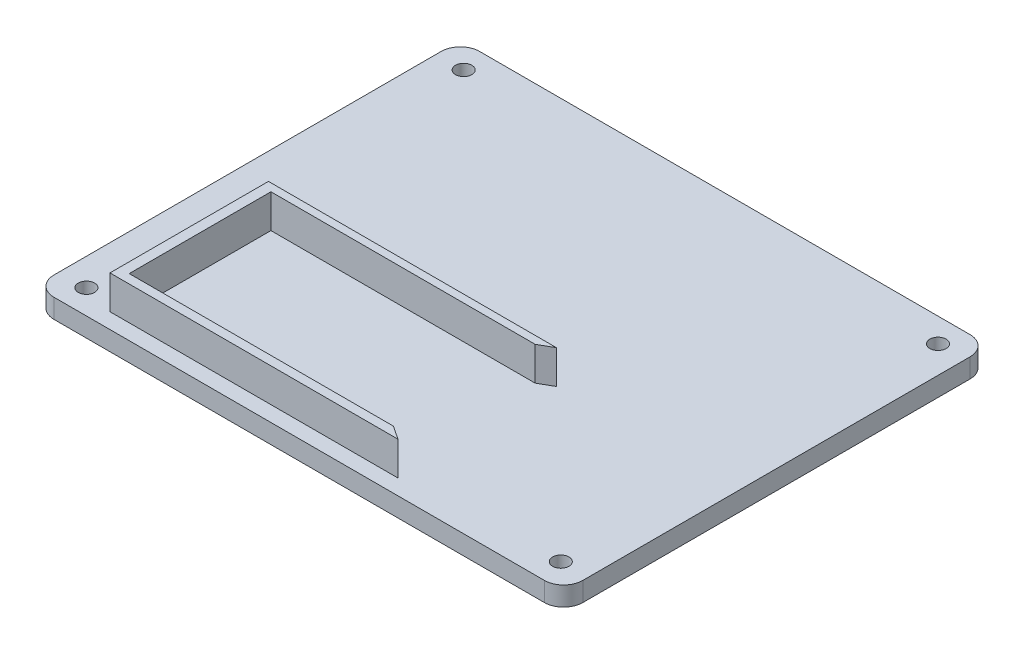
ISO-10303-21;
HEADER;
FILE_DESCRIPTION(('STEP AP214'),'2;1');
FILE_NAME('part.step','',(''),(''),'','','');
FILE_SCHEMA(('AUTOMOTIVE_DESIGN { 1 0 10303 214 1 1 1 1 }'));
ENDSEC;
DATA;
#1=APPLICATION_CONTEXT('core data for automotive mechanical design processes');
#2=APPLICATION_PROTOCOL_DEFINITION('international standard','automotive_design',2000,#1);
#3=PRODUCT_CONTEXT('',#1,'mechanical');
#4=PRODUCT('Part','Part','',(#3));
#5=PRODUCT_RELATED_PRODUCT_CATEGORY('part','',(#4));
#6=PRODUCT_DEFINITION_FORMATION('','',#4);
#7=PRODUCT_DEFINITION_CONTEXT('part definition',#1,'design');
#8=PRODUCT_DEFINITION('design','',#6,#7);
#9=PRODUCT_DEFINITION_SHAPE('','',#8);
#10=(LENGTH_UNIT() NAMED_UNIT(*) SI_UNIT(.MILLI.,.METRE.));
#11=(NAMED_UNIT(*) PLANE_ANGLE_UNIT() SI_UNIT($,.RADIAN.));
#12=(NAMED_UNIT(*) SI_UNIT($,.STERADIAN.) SOLID_ANGLE_UNIT());
#13=UNCERTAINTY_MEASURE_WITH_UNIT(LENGTH_MEASURE(1.E-05),#10,'distance_accuracy_value','');
#14=(GEOMETRIC_REPRESENTATION_CONTEXT(3) GLOBAL_UNCERTAINTY_ASSIGNED_CONTEXT((#13)) GLOBAL_UNIT_ASSIGNED_CONTEXT((#10,
#11,#12)) REPRESENTATION_CONTEXT('',''));
#15=CARTESIAN_POINT('',(0.,0.,0.));
#16=DIRECTION('',(0.,0.,1.));
#17=DIRECTION('',(1.,0.,0.));
#18=AXIS2_PLACEMENT_3D('',#15,#16,#17);
#19=CARTESIAN_POINT('',(-42.5927929016945,11.,1.87579116999913));
#20=DIRECTION('',(0.,0.,-1.));
#21=DIRECTION('',(-1.,0.,0.));
#22=AXIS2_PLACEMENT_3D('',#19,#20,#21);
#23=PLANE('',#22);
#24=DIRECTION('',(0.,-1.,0.));
#25=VECTOR('',#24,1.);
#26=CARTESIAN_POINT('',(-42.5927929016945,11.,1.87579116999913));
#27=LINE('',#26,#25);
#28=CARTESIAN_POINT('',(-42.5927929016945,11.,1.87579116999913));
#29=VERTEX_POINT('',#28);
#30=CARTESIAN_POINT('',(-42.5927929016945,4.,1.87579116999913));
#31=VERTEX_POINT('',#30);
#32=EDGE_CURVE('E165',#29,#31,#27,.T.);
#33=ORIENTED_EDGE('',*,*,#32,.T.);
#34=DIRECTION('',(1.,0.,0.));
#35=VECTOR('',#34,1.);
#36=CARTESIAN_POINT('',(-42.5927929016945,4.,1.87579116999913));
#37=LINE('',#36,#35);
#38=CARTESIAN_POINT('',(17.3465942983849,4.,1.87579116999913));
#39=VERTEX_POINT('',#38);
#40=EDGE_CURVE('E52',#31,#39,#37,.T.);
#41=ORIENTED_EDGE('',*,*,#40,.T.);
#42=DIRECTION('',(0.,-1.,0.));
#43=VECTOR('',#42,1.);
#44=CARTESIAN_POINT('',(17.3465942983849,11.,1.87579116999913));
#45=LINE('',#44,#43);
#46=CARTESIAN_POINT('',(17.3465942983849,11.,1.87579116999913));
#47=VERTEX_POINT('',#46);
#48=EDGE_CURVE('E11',#47,#39,#45,.T.);
#49=ORIENTED_EDGE('',*,*,#48,.F.);
#50=DIRECTION('',(1.,0.,0.));
#51=VECTOR('',#50,1.);
#52=CARTESIAN_POINT('',(-42.5927929016945,11.,1.87579116999913));
#53=LINE('',#52,#51);
#54=EDGE_CURVE('E250',#29,#47,#53,.T.);
#55=ORIENTED_EDGE('',*,*,#54,.F.);
#56=EDGE_LOOP('',(#33,#41,#49,#55));
#57=FACE_BOUND('',#56,.T.);
#58=ADVANCED_FACE('F39',(#57),#23,.F.);
#59=CARTESIAN_POINT('',(14.5352326793734,11.,0.));
#60=DIRECTION('',(0.555017681318776,0.,-0.831838550094626));
#61=DIRECTION('',(-0.831838550094626,0.,-0.555017681318776));
#62=AXIS2_PLACEMENT_3D('',#59,#60,#61);
#63=PLANE('',#62);
#64=DIRECTION('',(-0.831838550094626,0.,-0.555017681318776));
#65=VECTOR('',#64,1.);
#66=CARTESIAN_POINT('',(14.5352326793734,4.,0.));
#67=LINE('',#66,#65);
#68=CARTESIAN_POINT('',(14.5352326793734,4.,0.));
#69=VERTEX_POINT('',#68);
#70=EDGE_CURVE('E56',#39,#69,#67,.T.);
#71=ORIENTED_EDGE('',*,*,#70,.T.);
#72=DIRECTION('',(0.,-1.,0.));
#73=VECTOR('',#72,1.);
#74=CARTESIAN_POINT('',(14.5352326793734,11.,0.));
#75=LINE('',#74,#73);
#76=CARTESIAN_POINT('',(14.5352326793734,11.,0.));
#77=VERTEX_POINT('',#76);
#78=EDGE_CURVE('E46',#77,#69,#75,.T.);
#79=ORIENTED_EDGE('',*,*,#78,.F.);
#80=DIRECTION('',(0.831838550094626,0.,0.555017681318776));
#81=VECTOR('',#80,1.);
#82=CARTESIAN_POINT('',(14.5352326793734,11.,0.));
#83=LINE('',#82,#81);
#84=EDGE_CURVE('E249',#77,#47,#83,.T.);
#85=ORIENTED_EDGE('',*,*,#84,.T.);
#86=ORIENTED_EDGE('',*,*,#48,.T.);
#87=EDGE_LOOP('',(#71,#79,#85,#86));
#88=FACE_BOUND('',#87,.T.);
#89=ADVANCED_FACE('F301',(#88),#63,.T.);
#90=CARTESIAN_POINT('',(-40.4647673206266,11.,0.));
#91=DIRECTION('',(0.,0.,-1.));
#92=DIRECTION('',(-1.,0.,0.));
#93=AXIS2_PLACEMENT_3D('',#90,#91,#92);
#94=PLANE('',#93);
#95=DIRECTION('',(-1.,0.,0.));
#96=VECTOR('',#95,1.);
#97=CARTESIAN_POINT('',(-40.4647673206266,4.,0.));
#98=LINE('',#97,#96);
#99=CARTESIAN_POINT('',(-40.4647673206266,4.,0.));
#100=VERTEX_POINT('',#99);
#101=EDGE_CURVE('E182',#69,#100,#98,.T.);
#102=ORIENTED_EDGE('',*,*,#101,.T.);
#103=DIRECTION('',(0.,-1.,0.));
#104=VECTOR('',#103,1.);
#105=CARTESIAN_POINT('',(-40.4647673206266,11.,0.));
#106=LINE('',#105,#104);
#107=CARTESIAN_POINT('',(-40.4647673206266,11.,0.));
#108=VERTEX_POINT('',#107);
#109=EDGE_CURVE('E275',#108,#100,#106,.T.);
#110=ORIENTED_EDGE('',*,*,#109,.F.);
#111=DIRECTION('',(1.,0.,0.));
#112=VECTOR('',#111,1.);
#113=CARTESIAN_POINT('',(-40.4647673206266,11.,0.));
#114=LINE('',#113,#112);
#115=EDGE_CURVE('E252',#108,#77,#114,.T.);
#116=ORIENTED_EDGE('',*,*,#115,.T.);
#117=ORIENTED_EDGE('',*,*,#78,.T.);
#118=EDGE_LOOP('',(#102,#110,#116,#117));
#119=FACE_BOUND('',#118,.T.);
#120=ADVANCED_FACE('F277',(#119),#94,.T.);
#121=CARTESIAN_POINT('',(-40.4647673206266,11.,0.));
#122=DIRECTION('',(-1.,0.,0.));
#123=DIRECTION('',(0.,0.,1.));
#124=AXIS2_PLACEMENT_3D('',#121,#122,#123);
#125=PLANE('',#124);
#126=ORIENTED_EDGE('',*,*,#109,.T.);
#127=DIRECTION('',(0.,0.,-1.));
#128=VECTOR('',#127,1.);
#129=CARTESIAN_POINT('',(-40.4647673206266,4.,0.));
#130=LINE('',#129,#128);
#131=CARTESIAN_POINT('',(-40.4647673206266,4.,-29.5));
#132=VERTEX_POINT('',#131);
#133=EDGE_CURVE('E278',#100,#132,#130,.T.);
#134=ORIENTED_EDGE('',*,*,#133,.T.);
#135=DIRECTION('',(0.,-1.,0.));
#136=VECTOR('',#135,1.);
#137=CARTESIAN_POINT('',(-40.4647673206266,11.,-29.5));
#138=LINE('',#137,#136);
#139=CARTESIAN_POINT('',(-40.4647673206266,11.,-29.5));
#140=VERTEX_POINT('',#139);
#141=EDGE_CURVE('E267',#140,#132,#138,.T.);
#142=ORIENTED_EDGE('',*,*,#141,.F.);
#143=DIRECTION('',(0.,0.,-1.));
#144=VECTOR('',#143,1.);
#145=CARTESIAN_POINT('',(-40.4647673206266,11.,0.));
#146=LINE('',#145,#144);
#147=EDGE_CURVE('E254',#108,#140,#146,.T.);
#148=ORIENTED_EDGE('',*,*,#147,.F.);
#149=EDGE_LOOP('',(#126,#134,#142,#148));
#150=FACE_BOUND('',#149,.T.);
#151=ADVANCED_FACE('F298',(#150),#125,.F.);
#152=CARTESIAN_POINT('',(-40.4647673206266,11.,-29.5));
#153=DIRECTION('',(0.,0.,-1.));
#154=DIRECTION('',(-1.,0.,0.));
#155=AXIS2_PLACEMENT_3D('',#152,#153,#154);
#156=PLANE('',#155);
#157=ORIENTED_EDGE('',*,*,#141,.T.);
#158=DIRECTION('',(1.,0.,0.));
#159=VECTOR('',#158,1.);
#160=CARTESIAN_POINT('',(-40.4647673206266,4.,-29.5));
#161=LINE('',#160,#159);
#162=CARTESIAN_POINT('',(14.5352326793734,4.,-29.5));
#163=VERTEX_POINT('',#162);
#164=EDGE_CURVE('E284',#132,#163,#161,.T.);
#165=ORIENTED_EDGE('',*,*,#164,.T.);
#166=DIRECTION('',(0.,-1.,0.));
#167=VECTOR('',#166,1.);
#168=CARTESIAN_POINT('',(14.5352326793734,11.,-29.5));
#169=LINE('',#168,#167);
#170=CARTESIAN_POINT('',(14.5352326793734,11.,-29.5));
#171=VERTEX_POINT('',#170);
#172=EDGE_CURVE('E266',#171,#163,#169,.T.);
#173=ORIENTED_EDGE('',*,*,#172,.F.);
#174=DIRECTION('',(1.,0.,0.));
#175=VECTOR('',#174,1.);
#176=CARTESIAN_POINT('',(-40.4647673206266,11.,-29.5));
#177=LINE('',#176,#175);
#178=EDGE_CURVE('E260',#140,#171,#177,.T.);
#179=ORIENTED_EDGE('',*,*,#178,.F.);
#180=EDGE_LOOP('',(#157,#165,#173,#179));
#181=FACE_BOUND('',#180,.T.);
#182=ADVANCED_FACE('F296',(#181),#156,.F.);
#183=CARTESIAN_POINT('',(14.5352326793734,11.,-29.5));
#184=DIRECTION('',(-0.496630629517821,0.,-0.867961991002333));
#185=DIRECTION('',(-0.867961991002333,0.,0.496630629517821));
#186=AXIS2_PLACEMENT_3D('',#183,#184,#185);
#187=PLANE('',#186);
#188=ORIENTED_EDGE('',*,*,#172,.T.);
#189=DIRECTION('',(0.867961991002333,0.,-0.496630629517821));
#190=VECTOR('',#189,1.);
#191=CARTESIAN_POINT('',(14.5352326793734,4.,-29.5));
#192=LINE('',#191,#190);
#193=CARTESIAN_POINT('',(17.3465942983849,4.,-31.1086053365535));
#194=VERTEX_POINT('',#193);
#195=EDGE_CURVE('E174',#163,#194,#192,.T.);
#196=ORIENTED_EDGE('',*,*,#195,.T.);
#197=DIRECTION('',(0.,-1.,0.));
#198=VECTOR('',#197,1.);
#199=CARTESIAN_POINT('',(17.3465942983849,11.,-31.1086053365535));
#200=LINE('',#199,#198);
#201=CARTESIAN_POINT('',(17.3465942983849,11.,-31.1086053365535));
#202=VERTEX_POINT('',#201);
#203=EDGE_CURVE('E161',#202,#194,#200,.T.);
#204=ORIENTED_EDGE('',*,*,#203,.F.);
#205=DIRECTION('',(0.867961991002333,0.,-0.496630629517821));
#206=VECTOR('',#205,1.);
#207=CARTESIAN_POINT('',(14.5352326793734,11.,-29.5));
#208=LINE('',#207,#206);
#209=EDGE_CURVE('E259',#171,#202,#208,.T.);
#210=ORIENTED_EDGE('',*,*,#209,.F.);
#211=EDGE_LOOP('',(#188,#196,#204,#210));
#212=FACE_BOUND('',#211,.T.);
#213=ADVANCED_FACE('F295',(#212),#187,.F.);
#214=CARTESIAN_POINT('',(-42.5927929016945,11.,-31.1086053365535));
#215=DIRECTION('',(0.,0.,-1.));
#216=DIRECTION('',(-1.,0.,0.));
#217=AXIS2_PLACEMENT_3D('',#214,#215,#216);
#218=PLANE('',#217);
#219=DIRECTION('',(-1.,0.,0.));
#220=VECTOR('',#219,1.);
#221=CARTESIAN_POINT('',(-42.5927929016945,4.,-31.1086053365535));
#222=LINE('',#221,#220);
#223=CARTESIAN_POINT('',(-42.5927929016945,4.,-31.1086053365535));
#224=VERTEX_POINT('',#223);
#225=EDGE_CURVE('E167',#194,#224,#222,.T.);
#226=ORIENTED_EDGE('',*,*,#225,.T.);
#227=DIRECTION('',(0.,-1.,0.));
#228=VECTOR('',#227,1.);
#229=CARTESIAN_POINT('',(-42.5927929016945,11.,-31.1086053365535));
#230=LINE('',#229,#228);
#231=CARTESIAN_POINT('',(-42.5927929016945,11.,-31.1086053365535));
#232=VERTEX_POINT('',#231);
#233=EDGE_CURVE('E151',#232,#224,#230,.T.);
#234=ORIENTED_EDGE('',*,*,#233,.F.);
#235=DIRECTION('',(1.,0.,0.));
#236=VECTOR('',#235,1.);
#237=CARTESIAN_POINT('',(-42.5927929016945,11.,-31.1086053365535));
#238=LINE('',#237,#236);
#239=EDGE_CURVE('E261',#232,#202,#238,.T.);
#240=ORIENTED_EDGE('',*,*,#239,.T.);
#241=ORIENTED_EDGE('',*,*,#203,.T.);
#242=EDGE_LOOP('',(#226,#234,#240,#241));
#243=FACE_BOUND('',#242,.T.);
#244=ADVANCED_FACE('F170',(#243),#218,.T.);
#245=CARTESIAN_POINT('',(-42.5927929016945,11.,1.87579116999913));
#246=DIRECTION('',(-1.,0.,0.));
#247=DIRECTION('',(0.,0.,1.));
#248=AXIS2_PLACEMENT_3D('',#245,#246,#247);
#249=PLANE('',#248);
#250=DIRECTION('',(0.,0.,1.));
#251=VECTOR('',#250,1.);
#252=CARTESIAN_POINT('',(-42.5927929016945,4.,1.87579116999913));
#253=LINE('',#252,#251);
#254=EDGE_CURVE('E154',#224,#31,#253,.T.);
#255=ORIENTED_EDGE('',*,*,#254,.T.);
#256=ORIENTED_EDGE('',*,*,#32,.F.);
#257=DIRECTION('',(0.,0.,-1.));
#258=VECTOR('',#257,1.);
#259=CARTESIAN_POINT('',(-42.5927929016945,11.,1.87579116999913));
#260=LINE('',#259,#258);
#261=EDGE_CURVE('E160',#29,#232,#260,.T.);
#262=ORIENTED_EDGE('',*,*,#261,.T.);
#263=ORIENTED_EDGE('',*,*,#233,.T.);
#264=EDGE_LOOP('',(#255,#256,#262,#263));
#265=FACE_BOUND('',#264,.T.);
#266=ADVANCED_FACE('F153',(#265),#249,.T.);
#267=CARTESIAN_POINT('',(0.,11.,0.));
#268=DIRECTION('',(0.,1.,0.));
#269=DIRECTION('',(0.,0.,1.));
#270=AXIS2_PLACEMENT_3D('',#267,#268,#269);
#271=PLANE('',#270);
#272=ORIENTED_EDGE('',*,*,#54,.T.);
#273=ORIENTED_EDGE('',*,*,#84,.F.);
#274=ORIENTED_EDGE('',*,*,#115,.F.);
#275=ORIENTED_EDGE('',*,*,#147,.T.);
#276=ORIENTED_EDGE('',*,*,#178,.T.);
#277=ORIENTED_EDGE('',*,*,#209,.T.);
#278=ORIENTED_EDGE('',*,*,#239,.F.);
#279=ORIENTED_EDGE('',*,*,#261,.F.);
#280=EDGE_LOOP('',(#272,#273,#274,#275,#276,#277,#278,#279));
#281=FACE_BOUND('',#280,.T.);
#282=ADVANCED_FACE('F303',(#281),#271,.T.);
#283=CARTESIAN_POINT('',(51.045,4.,-79.51));
#284=DIRECTION('',(0.,1.,0.));
#285=DIRECTION('',(0.,0.,1.));
#286=AXIS2_PLACEMENT_3D('',#283,#284,#285);
#287=PLANE('',#286);
#288=CARTESIAN_POINT('',(49.365,4.,-78.51));
#289=DIRECTION('',(0.,1.,0.));
#290=DIRECTION('',(0.,0.,1.));
#291=AXIS2_PLACEMENT_3D('',#288,#289,#290);
#292=CIRCLE('',#291,1.7);
#293=CARTESIAN_POINT('',(49.365,4.,-76.81));
#294=VERTEX_POINT('',#293);
#295=EDGE_CURVE('E395',#294,#294,#292,.T.);
#296=ORIENTED_EDGE('',*,*,#295,.F.);
#297=EDGE_LOOP('',(#296));
#298=FACE_BOUND('',#297,.T.);
#299=ORIENTED_EDGE('',*,*,#164,.F.);
#300=ORIENTED_EDGE('',*,*,#133,.F.);
#301=ORIENTED_EDGE('',*,*,#101,.F.);
#302=ORIENTED_EDGE('',*,*,#70,.F.);
#303=ORIENTED_EDGE('',*,*,#40,.F.);
#304=ORIENTED_EDGE('',*,*,#254,.F.);
#305=ORIENTED_EDGE('',*,*,#225,.F.);
#306=ORIENTED_EDGE('',*,*,#195,.F.);
#307=EDGE_LOOP('',(#299,#300,#301,#302,#303,#304,#305,#306));
#308=FACE_BOUND('',#307,.T.);
#309=CARTESIAN_POINT('',(-49.365,4.,-78.51));
#310=DIRECTION('',(0.,1.,0.));
#311=DIRECTION('',(0.,0.,1.));
#312=AXIS2_PLACEMENT_3D('',#309,#310,#311);
#313=CIRCLE('',#312,1.7);
#314=CARTESIAN_POINT('',(-49.365,4.,-76.81));
#315=VERTEX_POINT('',#314);
#316=EDGE_CURVE('E184',#315,#315,#313,.T.);
#317=ORIENTED_EDGE('',*,*,#316,.F.);
#318=EDGE_LOOP('',(#317));
#319=FACE_BOUND('',#318,.T.);
#320=CARTESIAN_POINT('',(51.045,4.,-79.51));
#321=DIRECTION('',(0.,1.,0.));
#322=DIRECTION('',(0.,0.,1.));
#323=AXIS2_PLACEMENT_3D('',#320,#321,#322);
#324=CIRCLE('',#323,3.99999999999999);
#325=CARTESIAN_POINT('',(55.045,4.,-79.51));
#326=VERTEX_POINT('',#325);
#327=CARTESIAN_POINT('',(51.045,4.,-83.51));
#328=VERTEX_POINT('',#327);
#329=EDGE_CURVE('E187',#326,#328,#324,.T.);
#330=ORIENTED_EDGE('',*,*,#329,.T.);
#331=DIRECTION('',(-1.,0.,0.));
#332=VECTOR('',#331,1.);
#333=CARTESIAN_POINT('',(51.045,4.,-83.51));
#334=LINE('',#333,#332);
#335=CARTESIAN_POINT('',(-51.045,4.,-83.51));
#336=VERTEX_POINT('',#335);
#337=EDGE_CURVE('E191',#328,#336,#334,.T.);
#338=ORIENTED_EDGE('',*,*,#337,.T.);
#339=CARTESIAN_POINT('',(-51.045,4.,-79.51));
#340=DIRECTION('',(0.,1.,0.));
#341=DIRECTION('',(0.,0.,1.));
#342=AXIS2_PLACEMENT_3D('',#339,#340,#341);
#343=CIRCLE('',#342,3.99999999999999);
#344=CARTESIAN_POINT('',(-55.045,4.,-79.51));
#345=VERTEX_POINT('',#344);
#346=EDGE_CURVE('E198',#336,#345,#343,.T.);
#347=ORIENTED_EDGE('',*,*,#346,.T.);
#348=DIRECTION('',(0.,0.,1.));
#349=VECTOR('',#348,1.);
#350=CARTESIAN_POINT('',(-55.045,4.,-79.51));
#351=LINE('',#350,#349);
#352=CARTESIAN_POINT('',(-55.045,4.,1.09000000000001));
#353=VERTEX_POINT('',#352);
#354=EDGE_CURVE('E196',#345,#353,#351,.T.);
#355=ORIENTED_EDGE('',*,*,#354,.T.);
#356=CARTESIAN_POINT('',(-51.045,4.,1.09000000000001));
#357=DIRECTION('',(0.,1.,0.));
#358=DIRECTION('',(0.,0.,1.));
#359=AXIS2_PLACEMENT_3D('',#356,#357,#358);
#360=CIRCLE('',#359,4.);
#361=CARTESIAN_POINT('',(-51.045,4.,5.09000000000001));
#362=VERTEX_POINT('',#361);
#363=EDGE_CURVE('E199',#353,#362,#360,.T.);
#364=ORIENTED_EDGE('',*,*,#363,.T.);
#365=DIRECTION('',(1.,0.,0.));
#366=VECTOR('',#365,1.);
#367=CARTESIAN_POINT('',(-51.045,4.,5.09000000000001));
#368=LINE('',#367,#366);
#369=CARTESIAN_POINT('',(51.045,4.,5.09000000000001));
#370=VERTEX_POINT('',#369);
#371=EDGE_CURVE('E205',#362,#370,#368,.T.);
#372=ORIENTED_EDGE('',*,*,#371,.T.);
#373=CARTESIAN_POINT('',(51.045,4.,1.09000000000001));
#374=DIRECTION('',(0.,1.,0.));
#375=DIRECTION('',(0.,0.,-1.));
#376=AXIS2_PLACEMENT_3D('',#373,#374,#375);
#377=CIRCLE('',#376,4.);
#378=CARTESIAN_POINT('',(55.045,4.,1.09000000000001));
#379=VERTEX_POINT('',#378);
#380=EDGE_CURVE('E204',#370,#379,#377,.T.);
#381=ORIENTED_EDGE('',*,*,#380,.T.);
#382=DIRECTION('',(0.,0.,-1.));
#383=VECTOR('',#382,1.);
#384=CARTESIAN_POINT('',(55.045,4.,-79.51));
#385=LINE('',#384,#383);
#386=EDGE_CURVE('E206',#379,#326,#385,.T.);
#387=ORIENTED_EDGE('',*,*,#386,.T.);
#388=EDGE_LOOP('',(#330,#338,#347,#355,#364,#372,#381,#387));
#389=FACE_BOUND('',#388,.T.);
#390=CARTESIAN_POINT('',(49.365,4.,0.));
#391=DIRECTION('',(0.,1.,0.));
#392=DIRECTION('',(0.,0.,1.));
#393=AXIS2_PLACEMENT_3D('',#390,#391,#392);
#394=CIRCLE('',#393,1.7);
#395=CARTESIAN_POINT('',(49.365,4.,1.7));
#396=VERTEX_POINT('',#395);
#397=EDGE_CURVE('E283',#396,#396,#394,.T.);
#398=ORIENTED_EDGE('',*,*,#397,.F.);
#399=EDGE_LOOP('',(#398));
#400=FACE_BOUND('',#399,.T.);
#401=CARTESIAN_POINT('',(-49.365,4.,0.));
#402=DIRECTION('',(0.,1.,0.));
#403=DIRECTION('',(0.,0.,1.));
#404=AXIS2_PLACEMENT_3D('',#401,#402,#403);
#405=CIRCLE('',#404,1.7);
#406=CARTESIAN_POINT('',(-49.365,4.,1.70000000000001));
#407=VERTEX_POINT('',#406);
#408=EDGE_CURVE('E383',#407,#407,#405,.T.);
#409=ORIENTED_EDGE('',*,*,#408,.F.);
#410=EDGE_LOOP('',(#409));
#411=FACE_BOUND('',#410,.T.);
#412=ADVANCED_FACE('F173',(#298,#308,#319,#389,#400,#411),#287,.T.);
#413=CARTESIAN_POINT('',(51.045,4.,-79.51));
#414=DIRECTION('',(0.,-1.,0.));
#415=DIRECTION('',(0.,0.,-1.));
#416=AXIS2_PLACEMENT_3D('',#413,#414,#415);
#417=CYLINDRICAL_SURFACE('',#416,3.99999999999999);
#418=CARTESIAN_POINT('',(51.045,0.,-79.51));
#419=DIRECTION('',(0.,1.,0.));
#420=DIRECTION('',(0.,0.,1.));
#421=AXIS2_PLACEMENT_3D('',#418,#419,#420);
#422=CIRCLE('',#421,3.99999999999999);
#423=CARTESIAN_POINT('',(55.045,0.,-79.51));
#424=VERTEX_POINT('',#423);
#425=CARTESIAN_POINT('',(51.045,0.,-83.51));
#426=VERTEX_POINT('',#425);
#427=EDGE_CURVE('E186',#424,#426,#422,.T.);
#428=ORIENTED_EDGE('',*,*,#427,.T.);
#429=DIRECTION('',(0.,-1.,0.));
#430=VECTOR('',#429,1.);
#431=CARTESIAN_POINT('',(51.045,4.,-83.51));
#432=LINE('',#431,#430);
#433=EDGE_CURVE('E243',#328,#426,#432,.T.);
#434=ORIENTED_EDGE('',*,*,#433,.F.);
#435=ORIENTED_EDGE('',*,*,#329,.F.);
#436=DIRECTION('',(0.,-1.,0.));
#437=VECTOR('',#436,1.);
#438=CARTESIAN_POINT('',(55.045,4.,-79.51));
#439=LINE('',#438,#437);
#440=EDGE_CURVE('E208',#326,#424,#439,.T.);
#441=ORIENTED_EDGE('',*,*,#440,.T.);
#442=EDGE_LOOP('',(#428,#434,#435,#441));
#443=FACE_BOUND('',#442,.T.);
#444=ADVANCED_FACE('F329',(#443),#417,.T.);
#445=CARTESIAN_POINT('',(51.045,4.,-83.51));
#446=DIRECTION('',(0.,0.,1.));
#447=DIRECTION('',(1.,0.,0.));
#448=AXIS2_PLACEMENT_3D('',#445,#446,#447);
#449=PLANE('',#448);
#450=DIRECTION('',(-1.,0.,0.));
#451=VECTOR('',#450,1.);
#452=CARTESIAN_POINT('',(51.045,0.,-83.51));
#453=LINE('',#452,#451);
#454=CARTESIAN_POINT('',(-51.045,0.,-83.51));
#455=VERTEX_POINT('',#454);
#456=EDGE_CURVE('E211',#426,#455,#453,.T.);
#457=ORIENTED_EDGE('',*,*,#456,.T.);
#458=DIRECTION('',(0.,-1.,0.));
#459=VECTOR('',#458,1.);
#460=CARTESIAN_POINT('',(-51.045,4.,-83.51));
#461=LINE('',#460,#459);
#462=EDGE_CURVE('E244',#336,#455,#461,.T.);
#463=ORIENTED_EDGE('',*,*,#462,.F.);
#464=ORIENTED_EDGE('',*,*,#337,.F.);
#465=ORIENTED_EDGE('',*,*,#433,.T.);
#466=EDGE_LOOP('',(#457,#463,#464,#465));
#467=FACE_BOUND('',#466,.T.);
#468=ADVANCED_FACE('F334',(#467),#449,.F.);
#469=CARTESIAN_POINT('',(-51.045,4.,-79.51));
#470=DIRECTION('',(0.,-1.,0.));
#471=DIRECTION('',(0.,0.,-1.));
#472=AXIS2_PLACEMENT_3D('',#469,#470,#471);
#473=CYLINDRICAL_SURFACE('',#472,3.99999999999999);
#474=CARTESIAN_POINT('',(-51.045,0.,-79.51));
#475=DIRECTION('',(0.,1.,0.));
#476=DIRECTION('',(0.,0.,1.));
#477=AXIS2_PLACEMENT_3D('',#474,#475,#476);
#478=CIRCLE('',#477,3.99999999999999);
#479=CARTESIAN_POINT('',(-55.045,0.,-79.51));
#480=VERTEX_POINT('',#479);
#481=EDGE_CURVE('E213',#455,#480,#478,.T.);
#482=ORIENTED_EDGE('',*,*,#481,.T.);
#483=DIRECTION('',(0.,-1.,0.));
#484=VECTOR('',#483,1.);
#485=CARTESIAN_POINT('',(-55.045,4.,-79.51));
#486=LINE('',#485,#484);
#487=EDGE_CURVE('E236',#345,#480,#486,.T.);
#488=ORIENTED_EDGE('',*,*,#487,.F.);
#489=ORIENTED_EDGE('',*,*,#346,.F.);
#490=ORIENTED_EDGE('',*,*,#462,.T.);
#491=EDGE_LOOP('',(#482,#488,#489,#490));
#492=FACE_BOUND('',#491,.T.);
#493=ADVANCED_FACE('F336',(#492),#473,.T.);
#494=CARTESIAN_POINT('',(-55.045,4.,-79.51));
#495=DIRECTION('',(1.,0.,0.));
#496=DIRECTION('',(0.,0.,-1.));
#497=AXIS2_PLACEMENT_3D('',#494,#495,#496);
#498=PLANE('',#497);
#499=DIRECTION('',(0.,0.,1.));
#500=VECTOR('',#499,1.);
#501=CARTESIAN_POINT('',(-55.045,0.,-79.51));
#502=LINE('',#501,#500);
#503=CARTESIAN_POINT('',(-55.045,0.,1.09000000000001));
#504=VERTEX_POINT('',#503);
#505=EDGE_CURVE('E214',#480,#504,#502,.T.);
#506=ORIENTED_EDGE('',*,*,#505,.T.);
#507=DIRECTION('',(0.,-1.,0.));
#508=VECTOR('',#507,1.);
#509=CARTESIAN_POINT('',(-55.045,4.,1.09000000000001));
#510=LINE('',#509,#508);
#511=EDGE_CURVE('E232',#353,#504,#510,.T.);
#512=ORIENTED_EDGE('',*,*,#511,.F.);
#513=ORIENTED_EDGE('',*,*,#354,.F.);
#514=ORIENTED_EDGE('',*,*,#487,.T.);
#515=EDGE_LOOP('',(#506,#512,#513,#514));
#516=FACE_BOUND('',#515,.T.);
#517=ADVANCED_FACE('F343',(#516),#498,.F.);
#518=CARTESIAN_POINT('',(-51.045,4.,1.09000000000001));
#519=DIRECTION('',(0.,-1.,0.));
#520=DIRECTION('',(0.,0.,-1.));
#521=AXIS2_PLACEMENT_3D('',#518,#519,#520);
#522=CYLINDRICAL_SURFACE('',#521,4.);
#523=CARTESIAN_POINT('',(-51.045,0.,1.09000000000001));
#524=DIRECTION('',(0.,1.,0.));
#525=DIRECTION('',(0.,0.,1.));
#526=AXIS2_PLACEMENT_3D('',#523,#524,#525);
#527=CIRCLE('',#526,4.);
#528=CARTESIAN_POINT('',(-51.045,0.,5.09000000000001));
#529=VERTEX_POINT('',#528);
#530=EDGE_CURVE('E220',#504,#529,#527,.T.);
#531=ORIENTED_EDGE('',*,*,#530,.T.);
#532=DIRECTION('',(0.,-1.,0.));
#533=VECTOR('',#532,1.);
#534=CARTESIAN_POINT('',(-51.045,4.,5.09000000000001));
#535=LINE('',#534,#533);
#536=EDGE_CURVE('E235',#362,#529,#535,.T.);
#537=ORIENTED_EDGE('',*,*,#536,.F.);
#538=ORIENTED_EDGE('',*,*,#363,.F.);
#539=ORIENTED_EDGE('',*,*,#511,.T.);
#540=EDGE_LOOP('',(#531,#537,#538,#539));
#541=FACE_BOUND('',#540,.T.);
#542=ADVANCED_FACE('F342',(#541),#522,.T.);
#543=CARTESIAN_POINT('',(-51.045,4.,5.09000000000001));
#544=DIRECTION('',(0.,0.,-1.));
#545=DIRECTION('',(-1.,0.,0.));
#546=AXIS2_PLACEMENT_3D('',#543,#544,#545);
#547=PLANE('',#546);
#548=DIRECTION('',(1.,0.,0.));
#549=VECTOR('',#548,1.);
#550=CARTESIAN_POINT('',(-51.045,0.,5.09000000000001));
#551=LINE('',#550,#549);
#552=CARTESIAN_POINT('',(51.045,0.,5.09000000000001));
#553=VERTEX_POINT('',#552);
#554=EDGE_CURVE('E218',#529,#553,#551,.T.);
#555=ORIENTED_EDGE('',*,*,#554,.T.);
#556=DIRECTION('',(0.,-1.,0.));
#557=VECTOR('',#556,1.);
#558=CARTESIAN_POINT('',(51.045,4.,5.09000000000001));
#559=LINE('',#558,#557);
#560=EDGE_CURVE('E228',#370,#553,#559,.T.);
#561=ORIENTED_EDGE('',*,*,#560,.F.);
#562=ORIENTED_EDGE('',*,*,#371,.F.);
#563=ORIENTED_EDGE('',*,*,#536,.T.);
#564=EDGE_LOOP('',(#555,#561,#562,#563));
#565=FACE_BOUND('',#564,.T.);
#566=ADVANCED_FACE('F349',(#565),#547,.F.);
#567=CARTESIAN_POINT('',(51.045,4.,1.09000000000001));
#568=DIRECTION('',(0.,-1.,0.));
#569=DIRECTION('',(0.,0.,-1.));
#570=AXIS2_PLACEMENT_3D('',#567,#568,#569);
#571=CYLINDRICAL_SURFACE('',#570,4.);
#572=CARTESIAN_POINT('',(51.045,0.,1.09000000000001));
#573=DIRECTION('',(0.,1.,0.));
#574=DIRECTION('',(0.,0.,-1.));
#575=AXIS2_PLACEMENT_3D('',#572,#573,#574);
#576=CIRCLE('',#575,4.);
#577=CARTESIAN_POINT('',(55.045,0.,1.09000000000001));
#578=VERTEX_POINT('',#577);
#579=EDGE_CURVE('E222',#553,#578,#576,.T.);
#580=ORIENTED_EDGE('',*,*,#579,.T.);
#581=DIRECTION('',(0.,-1.,0.));
#582=VECTOR('',#581,1.);
#583=CARTESIAN_POINT('',(55.045,4.,1.09000000000001));
#584=LINE('',#583,#582);
#585=EDGE_CURVE('E229',#379,#578,#584,.T.);
#586=ORIENTED_EDGE('',*,*,#585,.F.);
#587=ORIENTED_EDGE('',*,*,#380,.F.);
#588=ORIENTED_EDGE('',*,*,#560,.T.);
#589=EDGE_LOOP('',(#580,#586,#587,#588));
#590=FACE_BOUND('',#589,.T.);
#591=ADVANCED_FACE('F355',(#590),#571,.T.);
#592=CARTESIAN_POINT('',(55.045,4.,-79.51));
#593=DIRECTION('',(-1.,0.,0.));
#594=DIRECTION('',(0.,0.,1.));
#595=AXIS2_PLACEMENT_3D('',#592,#593,#594);
#596=PLANE('',#595);
#597=DIRECTION('',(0.,0.,-1.));
#598=VECTOR('',#597,1.);
#599=CARTESIAN_POINT('',(55.045,0.,-79.51));
#600=LINE('',#599,#598);
#601=EDGE_CURVE('E194',#578,#424,#600,.T.);
#602=ORIENTED_EDGE('',*,*,#601,.T.);
#603=ORIENTED_EDGE('',*,*,#440,.F.);
#604=ORIENTED_EDGE('',*,*,#386,.F.);
#605=ORIENTED_EDGE('',*,*,#585,.T.);
#606=EDGE_LOOP('',(#602,#603,#604,#605));
#607=FACE_BOUND('',#606,.T.);
#608=ADVANCED_FACE('F360',(#607),#596,.F.);
#609=CARTESIAN_POINT('',(-49.365,4.,-78.51));
#610=DIRECTION('',(0.,-1.,0.));
#611=DIRECTION('',(0.,0.,-1.));
#612=AXIS2_PLACEMENT_3D('',#609,#610,#611);
#613=CYLINDRICAL_SURFACE('',#612,1.7);
#614=ORIENTED_EDGE('',*,*,#316,.T.);
#615=EDGE_LOOP('',(#614));
#616=FACE_BOUND('',#615,.T.);
#617=CARTESIAN_POINT('',(-49.365,0.,-78.51));
#618=DIRECTION('',(0.,1.,0.));
#619=DIRECTION('',(0.,0.,1.));
#620=AXIS2_PLACEMENT_3D('',#617,#618,#619);
#621=CIRCLE('',#620,1.7);
#622=CARTESIAN_POINT('',(-49.365,0.,-76.81));
#623=VERTEX_POINT('',#622);
#624=EDGE_CURVE('E181',#623,#623,#621,.T.);
#625=ORIENTED_EDGE('',*,*,#624,.F.);
#626=EDGE_LOOP('',(#625));
#627=FACE_BOUND('',#626,.T.);
#628=ADVANCED_FACE('F363',(#616,#627),#613,.F.);
#629=CARTESIAN_POINT('',(49.365,4.,0.));
#630=DIRECTION('',(0.,-1.,0.));
#631=DIRECTION('',(0.,0.,-1.));
#632=AXIS2_PLACEMENT_3D('',#629,#630,#631);
#633=CYLINDRICAL_SURFACE('',#632,1.7);
#634=ORIENTED_EDGE('',*,*,#397,.T.);
#635=EDGE_LOOP('',(#634));
#636=FACE_BOUND('',#635,.T.);
#637=CARTESIAN_POINT('',(49.365,0.,0.));
#638=DIRECTION('',(0.,1.,0.));
#639=DIRECTION('',(0.,0.,1.));
#640=AXIS2_PLACEMENT_3D('',#637,#638,#639);
#641=CIRCLE('',#640,1.7);
#642=CARTESIAN_POINT('',(49.365,0.,1.7));
#643=VERTEX_POINT('',#642);
#644=EDGE_CURVE('E286',#643,#643,#641,.T.);
#645=ORIENTED_EDGE('',*,*,#644,.F.);
#646=EDGE_LOOP('',(#645));
#647=FACE_BOUND('',#646,.T.);
#648=ADVANCED_FACE('F366',(#636,#647),#633,.F.);
#649=CARTESIAN_POINT('',(49.365,4.,-78.51));
#650=DIRECTION('',(0.,-1.,0.));
#651=DIRECTION('',(0.,0.,-1.));
#652=AXIS2_PLACEMENT_3D('',#649,#650,#651);
#653=CYLINDRICAL_SURFACE('',#652,1.7);
#654=ORIENTED_EDGE('',*,*,#295,.T.);
#655=EDGE_LOOP('',(#654));
#656=FACE_BOUND('',#655,.T.);
#657=CARTESIAN_POINT('',(49.365,0.,-78.51));
#658=DIRECTION('',(0.,1.,0.));
#659=DIRECTION('',(0.,0.,1.));
#660=AXIS2_PLACEMENT_3D('',#657,#658,#659);
#661=CIRCLE('',#660,1.7);
#662=CARTESIAN_POINT('',(49.365,0.,-76.81));
#663=VERTEX_POINT('',#662);
#664=EDGE_CURVE('E388',#663,#663,#661,.T.);
#665=ORIENTED_EDGE('',*,*,#664,.F.);
#666=EDGE_LOOP('',(#665));
#667=FACE_BOUND('',#666,.T.);
#668=ADVANCED_FACE('F375',(#656,#667),#653,.F.);
#669=CARTESIAN_POINT('',(-49.365,4.,0.));
#670=DIRECTION('',(0.,-1.,0.));
#671=DIRECTION('',(0.,0.,-1.));
#672=AXIS2_PLACEMENT_3D('',#669,#670,#671);
#673=CYLINDRICAL_SURFACE('',#672,1.7);
#674=ORIENTED_EDGE('',*,*,#408,.T.);
#675=EDGE_LOOP('',(#674));
#676=FACE_BOUND('',#675,.T.);
#677=CARTESIAN_POINT('',(-49.365,0.,0.));
#678=DIRECTION('',(0.,1.,0.));
#679=DIRECTION('',(0.,0.,1.));
#680=AXIS2_PLACEMENT_3D('',#677,#678,#679);
#681=CIRCLE('',#680,1.7);
#682=CARTESIAN_POINT('',(-49.365,0.,1.70000000000001));
#683=VERTEX_POINT('',#682);
#684=EDGE_CURVE('E390',#683,#683,#681,.T.);
#685=ORIENTED_EDGE('',*,*,#684,.F.);
#686=EDGE_LOOP('',(#685));
#687=FACE_BOUND('',#686,.T.);
#688=ADVANCED_FACE('F330',(#676,#687),#673,.F.);
#689=CARTESIAN_POINT('',(0.,0.,0.));
#690=DIRECTION('',(0.,1.,0.));
#691=DIRECTION('',(0.,0.,1.));
#692=AXIS2_PLACEMENT_3D('',#689,#690,#691);
#693=PLANE('',#692);
#694=ORIENTED_EDGE('',*,*,#624,.T.);
#695=EDGE_LOOP('',(#694));
#696=FACE_BOUND('',#695,.T.);
#697=ORIENTED_EDGE('',*,*,#427,.F.);
#698=ORIENTED_EDGE('',*,*,#601,.F.);
#699=ORIENTED_EDGE('',*,*,#579,.F.);
#700=ORIENTED_EDGE('',*,*,#554,.F.);
#701=ORIENTED_EDGE('',*,*,#530,.F.);
#702=ORIENTED_EDGE('',*,*,#505,.F.);
#703=ORIENTED_EDGE('',*,*,#481,.F.);
#704=ORIENTED_EDGE('',*,*,#456,.F.);
#705=EDGE_LOOP('',(#697,#698,#699,#700,#701,#702,#703,#704));
#706=FACE_BOUND('',#705,.T.);
#707=ORIENTED_EDGE('',*,*,#644,.T.);
#708=EDGE_LOOP('',(#707));
#709=FACE_BOUND('',#708,.T.);
#710=ORIENTED_EDGE('',*,*,#664,.T.);
#711=EDGE_LOOP('',(#710));
#712=FACE_BOUND('',#711,.T.);
#713=ORIENTED_EDGE('',*,*,#684,.T.);
#714=EDGE_LOOP('',(#713));
#715=FACE_BOUND('',#714,.T.);
#716=ADVANCED_FACE('F322',(#696,#706,#709,#712,#715),#693,.F.);
#717=CLOSED_SHELL('',(#58,#89,#120,#151,#182,#213,#244,#266,#282,#412,#444,#468,#493,#517,#542,
#566,#591,#608,#628,#648,#668,#688,#716));
#718=MANIFOLD_SOLID_BREP('B2',#717);
#719=ADVANCED_BREP_SHAPE_REPRESENTATION('',(#18,#718),#14);
#720=SHAPE_DEFINITION_REPRESENTATION(#9,#719);
ENDSEC;
END-ISO-10303-21;
